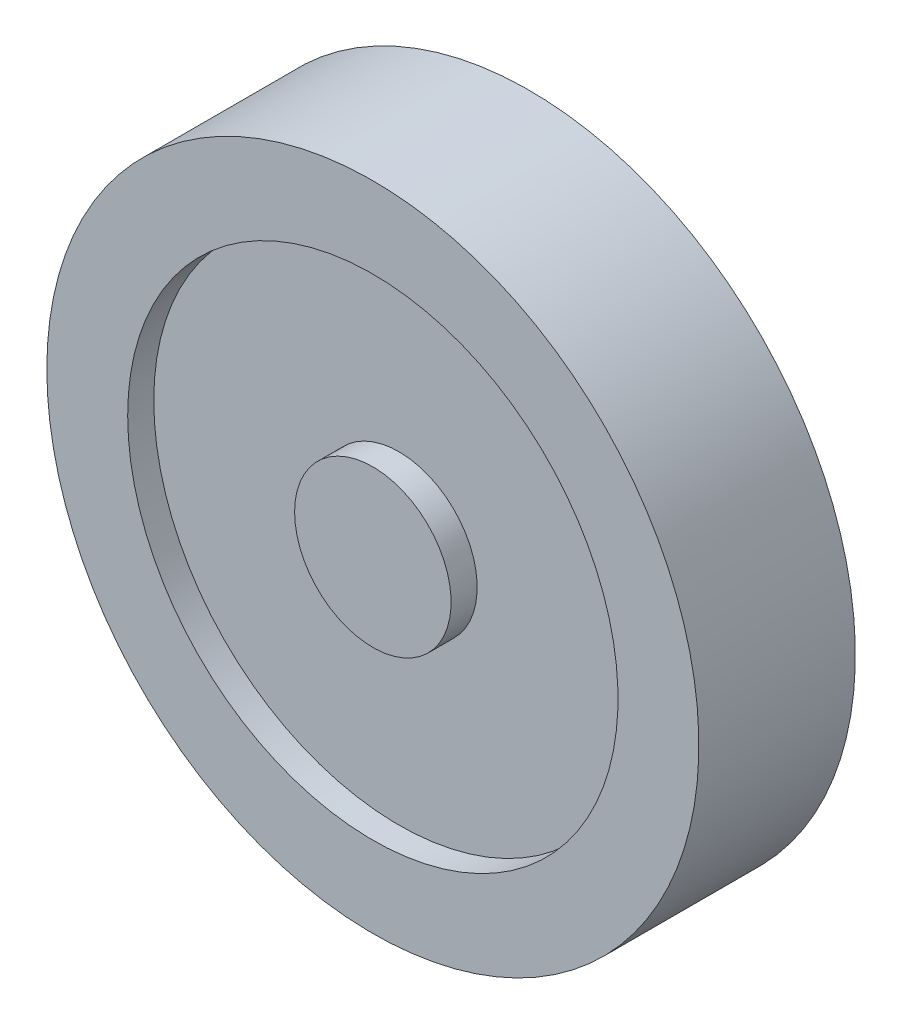
ISO-10303-21;
HEADER;
FILE_DESCRIPTION(('STEP AP214'),'2;1');
FILE_NAME('part.step','',(''),(''),'','','');
FILE_SCHEMA(('AUTOMOTIVE_DESIGN { 1 0 10303 214 1 1 1 1 }'));
ENDSEC;
DATA;
#1=APPLICATION_CONTEXT('core data for automotive mechanical design processes');
#2=APPLICATION_PROTOCOL_DEFINITION('international standard','automotive_design',2000,#1);
#3=PRODUCT_CONTEXT('',#1,'mechanical');
#4=PRODUCT('Part','Part','',(#3));
#5=PRODUCT_RELATED_PRODUCT_CATEGORY('part','',(#4));
#6=PRODUCT_DEFINITION_FORMATION('','',#4);
#7=PRODUCT_DEFINITION_CONTEXT('part definition',#1,'design');
#8=PRODUCT_DEFINITION('design','',#6,#7);
#9=PRODUCT_DEFINITION_SHAPE('','',#8);
#10=(LENGTH_UNIT() NAMED_UNIT(*) SI_UNIT(.MILLI.,.METRE.));
#11=(NAMED_UNIT(*) PLANE_ANGLE_UNIT() SI_UNIT($,.RADIAN.));
#12=(NAMED_UNIT(*) SI_UNIT($,.STERADIAN.) SOLID_ANGLE_UNIT());
#13=UNCERTAINTY_MEASURE_WITH_UNIT(LENGTH_MEASURE(1.E-05),#10,'distance_accuracy_value','');
#14=(GEOMETRIC_REPRESENTATION_CONTEXT(3) GLOBAL_UNCERTAINTY_ASSIGNED_CONTEXT((#13)) GLOBAL_UNIT_ASSIGNED_CONTEXT((#10,
#11,#12)) REPRESENTATION_CONTEXT('',''));
#15=CARTESIAN_POINT('',(0.,0.,0.));
#16=DIRECTION('',(0.,0.,1.));
#17=DIRECTION('',(1.,0.,0.));
#18=AXIS2_PLACEMENT_3D('',#15,#16,#17);
#19=CARTESIAN_POINT('',(0.,62.5,-15.));
#20=DIRECTION('',(0.,0.,1.));
#21=DIRECTION('',(1.,0.,0.));
#22=AXIS2_PLACEMENT_3D('',#19,#20,#21);
#23=PLANE('',#22);
#24=CARTESIAN_POINT('',(0.,62.5,-15.));
#25=DIRECTION('',(0.,0.,-1.));
#26=DIRECTION('',(-1.,0.,0.));
#27=AXIS2_PLACEMENT_3D('',#24,#25,#26);
#28=CIRCLE('',#27,15.);
#29=CARTESIAN_POINT('',(-15.,62.5,-15.));
#30=VERTEX_POINT('',#29);
#31=EDGE_CURVE('E10',#30,#30,#28,.T.);
#32=ORIENTED_EDGE('',*,*,#31,.T.);
#33=EDGE_LOOP('',(#32));
#34=FACE_BOUND('',#33,.T.);
#35=ADVANCED_FACE('F41',(#34),#23,.F.);
#36=CARTESIAN_POINT('',(0.,62.5,-20.));
#37=DIRECTION('',(0.,0.,-1.));
#38=DIRECTION('',(-1.,0.,0.));
#39=AXIS2_PLACEMENT_3D('',#36,#37,#38);
#40=CYLINDRICAL_SURFACE('',#39,15.);
#41=ORIENTED_EDGE('',*,*,#31,.F.);
#42=EDGE_LOOP('',(#41));
#43=FACE_BOUND('',#42,.T.);
#44=CARTESIAN_POINT('',(0.,62.5,-10.));
#45=DIRECTION('',(0.,0.,-1.));
#46=DIRECTION('',(-1.,0.,0.));
#47=AXIS2_PLACEMENT_3D('',#44,#45,#46);
#48=CIRCLE('',#47,15.);
#49=CARTESIAN_POINT('',(-15.,62.5,-10.));
#50=VERTEX_POINT('',#49);
#51=EDGE_CURVE('E50',#50,#50,#48,.T.);
#52=ORIENTED_EDGE('',*,*,#51,.T.);
#53=EDGE_LOOP('',(#52));
#54=FACE_BOUND('',#53,.T.);
#55=ADVANCED_FACE('F91',(#43,#54),#40,.T.);
#56=CARTESIAN_POINT('',(15.,62.5,-10.));
#57=DIRECTION('',(0.,0.,1.));
#58=DIRECTION('',(1.,0.,0.));
#59=AXIS2_PLACEMENT_3D('',#56,#57,#58);
#60=PLANE('',#59);
#61=ORIENTED_EDGE('',*,*,#51,.F.);
#62=EDGE_LOOP('',(#61));
#63=FACE_BOUND('',#62,.T.);
#64=CARTESIAN_POINT('',(0.,62.5,-10.));
#65=DIRECTION('',(0.,0.,-1.));
#66=DIRECTION('',(-1.,0.,0.));
#67=AXIS2_PLACEMENT_3D('',#64,#65,#66);
#68=CIRCLE('',#67,47.);
#69=CARTESIAN_POINT('',(-47.,62.5,-10.));
#70=VERTEX_POINT('',#69);
#71=EDGE_CURVE('E51',#70,#70,#68,.T.);
#72=ORIENTED_EDGE('',*,*,#71,.T.);
#73=EDGE_LOOP('',(#72));
#74=FACE_BOUND('',#73,.T.);
#75=ADVANCED_FACE('F94',(#63,#74),#60,.F.);
#76=CARTESIAN_POINT('',(0.,62.5,-20.));
#77=DIRECTION('',(0.,0.,-1.));
#78=DIRECTION('',(-1.,0.,0.));
#79=AXIS2_PLACEMENT_3D('',#76,#77,#78);
#80=CYLINDRICAL_SURFACE('',#79,47.);
#81=ORIENTED_EDGE('',*,*,#71,.F.);
#82=EDGE_LOOP('',(#81));
#83=FACE_BOUND('',#82,.T.);
#84=CARTESIAN_POINT('',(0.,62.5,-15.));
#85=DIRECTION('',(0.,0.,-1.));
#86=DIRECTION('',(-1.,0.,0.));
#87=AXIS2_PLACEMENT_3D('',#84,#85,#86);
#88=CIRCLE('',#87,47.);
#89=CARTESIAN_POINT('',(-47.,62.5,-15.));
#90=VERTEX_POINT('',#89);
#91=EDGE_CURVE('E54',#90,#90,#88,.T.);
#92=ORIENTED_EDGE('',*,*,#91,.T.);
#93=EDGE_LOOP('',(#92));
#94=FACE_BOUND('',#93,.T.);
#95=ADVANCED_FACE('F99',(#83,#94),#80,.F.);
#96=CARTESIAN_POINT('',(47.,62.5,-15.));
#97=DIRECTION('',(0.,0.,1.));
#98=DIRECTION('',(1.,0.,0.));
#99=AXIS2_PLACEMENT_3D('',#96,#97,#98);
#100=PLANE('',#99);
#101=ORIENTED_EDGE('',*,*,#91,.F.);
#102=EDGE_LOOP('',(#101));
#103=FACE_BOUND('',#102,.T.);
#104=CARTESIAN_POINT('',(0.,62.5,-15.));
#105=DIRECTION('',(0.,0.,-1.));
#106=DIRECTION('',(-1.,0.,0.));
#107=AXIS2_PLACEMENT_3D('',#104,#105,#106);
#108=CIRCLE('',#107,62.5);
#109=CARTESIAN_POINT('',(-62.5,62.5,-15.));
#110=VERTEX_POINT('',#109);
#111=EDGE_CURVE('E58',#110,#110,#108,.T.);
#112=ORIENTED_EDGE('',*,*,#111,.T.);
#113=EDGE_LOOP('',(#112));
#114=FACE_BOUND('',#113,.T.);
#115=ADVANCED_FACE('F107',(#103,#114),#100,.F.);
#116=CARTESIAN_POINT('',(0.,62.5,-20.));
#117=DIRECTION('',(0.,0.,-1.));
#118=DIRECTION('',(-1.,0.,0.));
#119=AXIS2_PLACEMENT_3D('',#116,#117,#118);
#120=CYLINDRICAL_SURFACE('',#119,62.5);
#121=ORIENTED_EDGE('',*,*,#111,.F.);
#122=EDGE_LOOP('',(#121));
#123=FACE_BOUND('',#122,.T.);
#124=CARTESIAN_POINT('',(0.,62.5,15.));
#125=DIRECTION('',(0.,0.,-1.));
#126=DIRECTION('',(-1.,0.,0.));
#127=AXIS2_PLACEMENT_3D('',#124,#125,#126);
#128=CIRCLE('',#127,62.5);
#129=CARTESIAN_POINT('',(-62.5,62.5,15.));
#130=VERTEX_POINT('',#129);
#131=EDGE_CURVE('E65',#130,#130,#128,.T.);
#132=ORIENTED_EDGE('',*,*,#131,.T.);
#133=EDGE_LOOP('',(#132));
#134=FACE_BOUND('',#133,.T.);
#135=ADVANCED_FACE('F108',(#123,#134),#120,.T.);
#136=CARTESIAN_POINT('',(62.5,62.5,15.));
#137=DIRECTION('',(0.,0.,-1.));
#138=DIRECTION('',(-1.,0.,0.));
#139=AXIS2_PLACEMENT_3D('',#136,#137,#138);
#140=PLANE('',#139);
#141=ORIENTED_EDGE('',*,*,#131,.F.);
#142=EDGE_LOOP('',(#141));
#143=FACE_BOUND('',#142,.T.);
#144=CARTESIAN_POINT('',(0.,62.5,15.));
#145=DIRECTION('',(0.,0.,-1.));
#146=DIRECTION('',(-1.,0.,0.));
#147=AXIS2_PLACEMENT_3D('',#144,#145,#146);
#148=CIRCLE('',#147,47.);
#149=CARTESIAN_POINT('',(-47.,62.5,15.));
#150=VERTEX_POINT('',#149);
#151=EDGE_CURVE('E67',#150,#150,#148,.T.);
#152=ORIENTED_EDGE('',*,*,#151,.T.);
#153=EDGE_LOOP('',(#152));
#154=FACE_BOUND('',#153,.T.);
#155=ADVANCED_FACE('F114',(#143,#154),#140,.F.);
#156=CARTESIAN_POINT('',(0.,62.5,-20.));
#157=DIRECTION('',(0.,0.,-1.));
#158=DIRECTION('',(-1.,0.,0.));
#159=AXIS2_PLACEMENT_3D('',#156,#157,#158);
#160=CYLINDRICAL_SURFACE('',#159,47.);
#161=ORIENTED_EDGE('',*,*,#151,.F.);
#162=EDGE_LOOP('',(#161));
#163=FACE_BOUND('',#162,.T.);
#164=CARTESIAN_POINT('',(0.,62.5,10.));
#165=DIRECTION('',(0.,0.,-1.));
#166=DIRECTION('',(-1.,0.,0.));
#167=AXIS2_PLACEMENT_3D('',#164,#165,#166);
#168=CIRCLE('',#167,47.);
#169=CARTESIAN_POINT('',(-47.,62.5,10.));
#170=VERTEX_POINT('',#169);
#171=EDGE_CURVE('E69',#170,#170,#168,.T.);
#172=ORIENTED_EDGE('',*,*,#171,.T.);
#173=EDGE_LOOP('',(#172));
#174=FACE_BOUND('',#173,.T.);
#175=ADVANCED_FACE('F120',(#163,#174),#160,.F.);
#176=CARTESIAN_POINT('',(47.,62.5,10.));
#177=DIRECTION('',(0.,0.,-1.));
#178=DIRECTION('',(-1.,0.,0.));
#179=AXIS2_PLACEMENT_3D('',#176,#177,#178);
#180=PLANE('',#179);
#181=ORIENTED_EDGE('',*,*,#171,.F.);
#182=EDGE_LOOP('',(#181));
#183=FACE_BOUND('',#182,.T.);
#184=CARTESIAN_POINT('',(0.,62.5,10.));
#185=DIRECTION('',(0.,0.,-1.));
#186=DIRECTION('',(-1.,0.,0.));
#187=AXIS2_PLACEMENT_3D('',#184,#185,#186);
#188=CIRCLE('',#187,15.);
#189=CARTESIAN_POINT('',(-15.,62.5,10.));
#190=VERTEX_POINT('',#189);
#191=EDGE_CURVE('E74',#190,#190,#188,.T.);
#192=ORIENTED_EDGE('',*,*,#191,.T.);
#193=EDGE_LOOP('',(#192));
#194=FACE_BOUND('',#193,.T.);
#195=ADVANCED_FACE('F90',(#183,#194),#180,.F.);
#196=CARTESIAN_POINT('',(0.,62.5,-20.));
#197=DIRECTION('',(0.,0.,-1.));
#198=DIRECTION('',(-1.,0.,0.));
#199=AXIS2_PLACEMENT_3D('',#196,#197,#198);
#200=CYLINDRICAL_SURFACE('',#199,15.);
#201=ORIENTED_EDGE('',*,*,#191,.F.);
#202=EDGE_LOOP('',(#201));
#203=FACE_BOUND('',#202,.T.);
#204=CARTESIAN_POINT('',(0.,62.5,15.));
#205=DIRECTION('',(0.,0.,-1.));
#206=DIRECTION('',(-1.,0.,0.));
#207=AXIS2_PLACEMENT_3D('',#204,#205,#206);
#208=CIRCLE('',#207,15.);
#209=CARTESIAN_POINT('',(-15.,62.5,15.));
#210=VERTEX_POINT('',#209);
#211=EDGE_CURVE('E73',#210,#210,#208,.T.);
#212=ORIENTED_EDGE('',*,*,#211,.T.);
#213=EDGE_LOOP('',(#212));
#214=FACE_BOUND('',#213,.T.);
#215=ADVANCED_FACE('F80',(#203,#214),#200,.T.);
#216=CARTESIAN_POINT('',(15.,62.5,15.));
#217=DIRECTION('',(0.,0.,-1.));
#218=DIRECTION('',(-1.,0.,0.));
#219=AXIS2_PLACEMENT_3D('',#216,#217,#218);
#220=PLANE('',#219);
#221=ORIENTED_EDGE('',*,*,#211,.F.);
#222=EDGE_LOOP('',(#221));
#223=FACE_BOUND('',#222,.T.);
#224=ADVANCED_FACE('F83',(#223),#220,.F.);
#225=CLOSED_SHELL('',(#35,#55,#75,#95,#115,#135,#155,#175,#195,#215,#224));
#226=MANIFOLD_SOLID_BREP('B2',#225);
#227=ADVANCED_BREP_SHAPE_REPRESENTATION('',(#18,#226),#14);
#228=SHAPE_DEFINITION_REPRESENTATION(#9,#227);
ENDSEC;
END-ISO-10303-21;
